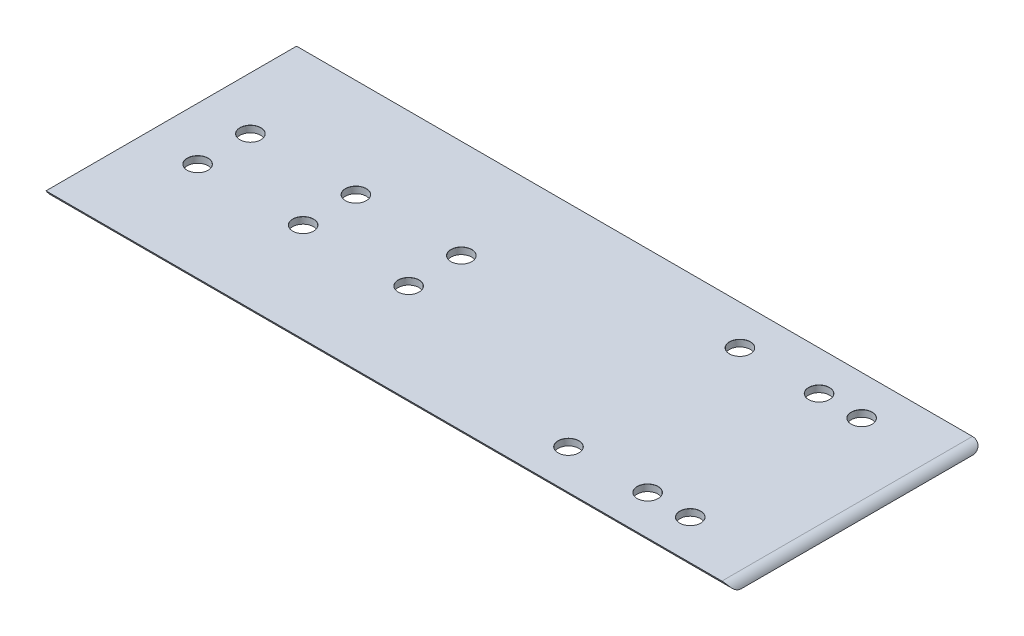
ISO-10303-21;
HEADER;
FILE_DESCRIPTION(('STEP AP214'),'2;1');
FILE_NAME('part.step','',(''),(''),'','','');
FILE_SCHEMA(('AUTOMOTIVE_DESIGN { 1 0 10303 214 1 1 1 1 }'));
ENDSEC;
DATA;
#1=APPLICATION_CONTEXT('core data for automotive mechanical design processes');
#2=APPLICATION_PROTOCOL_DEFINITION('international standard','automotive_design',2000,#1);
#3=PRODUCT_CONTEXT('',#1,'mechanical');
#4=PRODUCT('Part','Part','',(#3));
#5=PRODUCT_RELATED_PRODUCT_CATEGORY('part','',(#4));
#6=PRODUCT_DEFINITION_FORMATION('','',#4);
#7=PRODUCT_DEFINITION_CONTEXT('part definition',#1,'design');
#8=PRODUCT_DEFINITION('design','',#6,#7);
#9=PRODUCT_DEFINITION_SHAPE('','',#8);
#10=(LENGTH_UNIT() NAMED_UNIT(*) SI_UNIT(.MILLI.,.METRE.));
#11=(NAMED_UNIT(*) PLANE_ANGLE_UNIT() SI_UNIT($,.RADIAN.));
#12=(NAMED_UNIT(*) SI_UNIT($,.STERADIAN.) SOLID_ANGLE_UNIT());
#13=UNCERTAINTY_MEASURE_WITH_UNIT(LENGTH_MEASURE(1.E-05),#10,'distance_accuracy_value','');
#14=(GEOMETRIC_REPRESENTATION_CONTEXT(3) GLOBAL_UNCERTAINTY_ASSIGNED_CONTEXT((#13)) GLOBAL_UNIT_ASSIGNED_CONTEXT((#10,
#11,#12)) REPRESENTATION_CONTEXT('',''));
#15=CARTESIAN_POINT('',(0.,0.,0.));
#16=DIRECTION('',(0.,0.,1.));
#17=DIRECTION('',(1.,0.,0.));
#18=AXIS2_PLACEMENT_3D('',#15,#16,#17);
#19=CARTESIAN_POINT('',(0.,98.1075,-71.4375));
#20=DIRECTION('',(0.,1.,0.));
#21=DIRECTION('',(0.,0.,1.));
#22=AXIS2_PLACEMENT_3D('',#19,#20,#21);
#23=PLANE('',#22);
#24=CARTESIAN_POINT('',(167.083317581196,98.1075,-122.2375));
#25=DIRECTION('',(0.,1.,0.));
#26=DIRECTION('',(0.,0.,1.));
#27=AXIS2_PLACEMENT_3D('',#24,#25,#26);
#28=CIRCLE('',#27,2.5);
#29=CARTESIAN_POINT('',(167.083317581196,98.1075,-119.7375));
#30=VERTEX_POINT('',#29);
#31=EDGE_CURVE('E237',#30,#30,#28,.T.);
#32=ORIENTED_EDGE('',*,*,#31,.T.);
#33=EDGE_LOOP('',(#32));
#34=FACE_BOUND('',#33,.T.);
#35=CARTESIAN_POINT('',(167.083317581196,98.1075,-80.9625));
#36=DIRECTION('',(0.,1.,0.));
#37=DIRECTION('',(0.,0.,1.));
#38=AXIS2_PLACEMENT_3D('',#35,#36,#37);
#39=CIRCLE('',#38,2.5);
#40=CARTESIAN_POINT('',(167.083317581196,98.1075,-78.4625));
#41=VERTEX_POINT('',#40);
#42=EDGE_CURVE('E228',#41,#41,#39,.T.);
#43=ORIENTED_EDGE('',*,*,#42,.T.);
#44=EDGE_LOOP('',(#43));
#45=FACE_BOUND('',#44,.T.);
#46=CARTESIAN_POINT('',(186.133317581196,98.1075,-80.9625));
#47=DIRECTION('',(0.,1.,0.));
#48=DIRECTION('',(0.,0.,1.));
#49=AXIS2_PLACEMENT_3D('',#46,#47,#48);
#50=CIRCLE('',#49,2.5);
#51=CARTESIAN_POINT('',(186.133317581196,98.1075,-78.4625));
#52=VERTEX_POINT('',#51);
#53=EDGE_CURVE('E219',#52,#52,#50,.T.);
#54=ORIENTED_EDGE('',*,*,#53,.T.);
#55=EDGE_LOOP('',(#54));
#56=FACE_BOUND('',#55,.T.);
#57=CARTESIAN_POINT('',(196.394917581196,98.1075,-80.9625));
#58=DIRECTION('',(0.,1.,0.));
#59=DIRECTION('',(0.,0.,1.));
#60=AXIS2_PLACEMENT_3D('',#57,#58,#59);
#61=CIRCLE('',#60,2.5);
#62=CARTESIAN_POINT('',(196.394917581196,98.1075,-78.4625));
#63=VERTEX_POINT('',#62);
#64=EDGE_CURVE('E210',#63,#63,#61,.T.);
#65=ORIENTED_EDGE('',*,*,#64,.T.);
#66=EDGE_LOOP('',(#65));
#67=FACE_BOUND('',#66,.T.);
#68=CARTESIAN_POINT('',(196.394917581196,98.1075,-122.2375));
#69=DIRECTION('',(0.,1.,0.));
#70=DIRECTION('',(0.,0.,1.));
#71=AXIS2_PLACEMENT_3D('',#68,#69,#70);
#72=CIRCLE('',#71,2.5);
#73=CARTESIAN_POINT('',(196.394917581196,98.1075,-119.7375));
#74=VERTEX_POINT('',#73);
#75=EDGE_CURVE('E201',#74,#74,#72,.T.);
#76=ORIENTED_EDGE('',*,*,#75,.T.);
#77=EDGE_LOOP('',(#76));
#78=FACE_BOUND('',#77,.T.);
#79=CARTESIAN_POINT('',(186.133317581196,98.1075,-122.2375));
#80=DIRECTION('',(0.,1.,0.));
#81=DIRECTION('',(0.,0.,1.));
#82=AXIS2_PLACEMENT_3D('',#79,#80,#81);
#83=CIRCLE('',#82,2.5);
#84=CARTESIAN_POINT('',(186.133317581196,98.1075,-119.7375));
#85=VERTEX_POINT('',#84);
#86=EDGE_CURVE('E192',#85,#85,#83,.T.);
#87=ORIENTED_EDGE('',*,*,#86,.T.);
#88=EDGE_LOOP('',(#87));
#89=FACE_BOUND('',#88,.T.);
#90=CARTESIAN_POINT('',(114.3,98.1075,-107.95));
#91=DIRECTION('',(0.,1.,0.));
#92=DIRECTION('',(0.,0.,1.));
#93=AXIS2_PLACEMENT_3D('',#90,#91,#92);
#94=CIRCLE('',#93,2.5);
#95=CARTESIAN_POINT('',(114.3,98.1075,-105.45));
#96=VERTEX_POINT('',#95);
#97=EDGE_CURVE('E183',#96,#96,#94,.T.);
#98=ORIENTED_EDGE('',*,*,#97,.T.);
#99=EDGE_LOOP('',(#98));
#100=FACE_BOUND('',#99,.T.);
#101=CARTESIAN_POINT('',(114.3,98.1075,-95.25));
#102=DIRECTION('',(0.,1.,0.));
#103=DIRECTION('',(0.,0.,1.));
#104=AXIS2_PLACEMENT_3D('',#101,#102,#103);
#105=CIRCLE('',#104,2.5);
#106=CARTESIAN_POINT('',(114.3,98.1075,-92.75));
#107=VERTEX_POINT('',#106);
#108=EDGE_CURVE('E174',#107,#107,#105,.T.);
#109=ORIENTED_EDGE('',*,*,#108,.T.);
#110=EDGE_LOOP('',(#109));
#111=FACE_BOUND('',#110,.T.);
#112=CARTESIAN_POINT('',(88.9000000000002,98.1075,-95.25));
#113=DIRECTION('',(0.,1.,0.));
#114=DIRECTION('',(0.,0.,1.));
#115=AXIS2_PLACEMENT_3D('',#112,#113,#114);
#116=CIRCLE('',#115,2.5);
#117=CARTESIAN_POINT('',(88.9000000000002,98.1075,-92.75));
#118=VERTEX_POINT('',#117);
#119=EDGE_CURVE('E165',#118,#118,#116,.T.);
#120=ORIENTED_EDGE('',*,*,#119,.T.);
#121=EDGE_LOOP('',(#120));
#122=FACE_BOUND('',#121,.T.);
#123=CARTESIAN_POINT('',(88.9,98.1075,-107.95));
#124=DIRECTION('',(0.,1.,0.));
#125=DIRECTION('',(0.,0.,1.));
#126=AXIS2_PLACEMENT_3D('',#123,#124,#125);
#127=CIRCLE('',#126,2.5);
#128=CARTESIAN_POINT('',(88.9,98.1075,-105.45));
#129=VERTEX_POINT('',#128);
#130=EDGE_CURVE('E156',#129,#129,#127,.T.);
#131=ORIENTED_EDGE('',*,*,#130,.T.);
#132=EDGE_LOOP('',(#131));
#133=FACE_BOUND('',#132,.T.);
#134=CARTESIAN_POINT('',(63.5,98.1075,-107.95));
#135=DIRECTION('',(0.,1.,0.));
#136=DIRECTION('',(0.,0.,1.));
#137=AXIS2_PLACEMENT_3D('',#134,#135,#136);
#138=CIRCLE('',#137,2.5);
#139=CARTESIAN_POINT('',(63.5,98.1075,-105.45));
#140=VERTEX_POINT('',#139);
#141=EDGE_CURVE('E147',#140,#140,#138,.T.);
#142=ORIENTED_EDGE('',*,*,#141,.T.);
#143=EDGE_LOOP('',(#142));
#144=FACE_BOUND('',#143,.T.);
#145=CARTESIAN_POINT('',(63.5000000000002,98.1075,-95.25));
#146=DIRECTION('',(0.,1.,0.));
#147=DIRECTION('',(0.,0.,1.));
#148=AXIS2_PLACEMENT_3D('',#145,#146,#147);
#149=CIRCLE('',#148,2.5);
#150=CARTESIAN_POINT('',(63.5000000000002,98.1075,-92.75));
#151=VERTEX_POINT('',#150);
#152=EDGE_CURVE('E137',#151,#151,#149,.T.);
#153=ORIENTED_EDGE('',*,*,#152,.T.);
#154=EDGE_LOOP('',(#153));
#155=FACE_BOUND('',#154,.T.);
#156=DIRECTION('',(0.,0.,-1.));
#157=VECTOR('',#156,1.);
#158=CARTESIAN_POINT('',(53.1546430196529,98.1075,-71.4375));
#159=LINE('',#158,#157);
#160=CARTESIAN_POINT('',(53.1546430196529,98.1075,-73.7921430196529));
#161=VERTEX_POINT('',#160);
#162=CARTESIAN_POINT('',(53.1546430196529,98.1075,-129.407856980347));
#163=VERTEX_POINT('',#162);
#164=EDGE_CURVE('E63',#161,#163,#159,.T.);
#165=ORIENTED_EDGE('',*,*,#164,.T.);
#166=DIRECTION('',(-1.,0.,0.));
#167=VECTOR('',#166,1.);
#168=CARTESIAN_POINT('',(0.,98.1075,-129.407856980347));
#169=LINE('',#168,#167);
#170=CARTESIAN_POINT('',(215.9,98.1075,-129.407856980347));
#171=VERTEX_POINT('',#170);
#172=EDGE_CURVE('E105',#163,#171,#169,.F.);
#173=ORIENTED_EDGE('',*,*,#172,.T.);
#174=DIRECTION('',(0.,0.,-1.));
#175=VECTOR('',#174,1.);
#176=CARTESIAN_POINT('',(215.9,98.1075,-71.4375));
#177=LINE('',#176,#175);
#178=CARTESIAN_POINT('',(215.9,98.1075,-73.7921430196529));
#179=VERTEX_POINT('',#178);
#180=EDGE_CURVE('E99',#179,#171,#177,.T.);
#181=ORIENTED_EDGE('',*,*,#180,.F.);
#182=DIRECTION('',(-1.,0.,0.));
#183=VECTOR('',#182,1.);
#184=CARTESIAN_POINT('',(0.,98.1075,-73.7921430196529));
#185=LINE('',#184,#183);
#186=EDGE_CURVE('E106',#179,#161,#185,.T.);
#187=ORIENTED_EDGE('',*,*,#186,.T.);
#188=EDGE_LOOP('',(#165,#173,#181,#187));
#189=FACE_BOUND('',#188,.T.);
#190=ADVANCED_FACE('F47',(#34,#45,#56,#67,#78,#89,#100,#111,#122,#133,#144,#155,#189),#23,.F.);
#191=CARTESIAN_POINT('',(0.,99.695,-71.4375));
#192=DIRECTION('',(0.,1.,0.));
#193=DIRECTION('',(0.,0.,1.));
#194=AXIS2_PLACEMENT_3D('',#191,#192,#193);
#195=PLANE('',#194);
#196=CARTESIAN_POINT('',(167.083317581196,99.695,-122.2375));
#197=DIRECTION('',(0.,1.,0.));
#198=DIRECTION('',(0.,0.,1.));
#199=AXIS2_PLACEMENT_3D('',#196,#197,#198);
#200=CIRCLE('',#199,2.525);
#201=CARTESIAN_POINT('',(167.083317581196,99.695,-119.7125));
#202=VERTEX_POINT('',#201);
#203=EDGE_CURVE('E243',#202,#202,#200,.T.);
#204=ORIENTED_EDGE('',*,*,#203,.F.);
#205=EDGE_LOOP('',(#204));
#206=FACE_BOUND('',#205,.T.);
#207=CARTESIAN_POINT('',(167.083317581196,99.695,-80.9625));
#208=DIRECTION('',(0.,1.,0.));
#209=DIRECTION('',(0.,0.,1.));
#210=AXIS2_PLACEMENT_3D('',#207,#208,#209);
#211=CIRCLE('',#210,2.525);
#212=CARTESIAN_POINT('',(167.083317581196,99.695,-78.4375));
#213=VERTEX_POINT('',#212);
#214=EDGE_CURVE('E234',#213,#213,#211,.T.);
#215=ORIENTED_EDGE('',*,*,#214,.F.);
#216=EDGE_LOOP('',(#215));
#217=FACE_BOUND('',#216,.T.);
#218=CARTESIAN_POINT('',(186.133317581196,99.695,-80.9625));
#219=DIRECTION('',(0.,1.,0.));
#220=DIRECTION('',(0.,0.,1.));
#221=AXIS2_PLACEMENT_3D('',#218,#219,#220);
#222=CIRCLE('',#221,2.525);
#223=CARTESIAN_POINT('',(186.133317581196,99.695,-78.4375));
#224=VERTEX_POINT('',#223);
#225=EDGE_CURVE('E225',#224,#224,#222,.T.);
#226=ORIENTED_EDGE('',*,*,#225,.F.);
#227=EDGE_LOOP('',(#226));
#228=FACE_BOUND('',#227,.T.);
#229=CARTESIAN_POINT('',(196.394917581196,99.695,-80.9625));
#230=DIRECTION('',(0.,1.,0.));
#231=DIRECTION('',(0.,0.,1.));
#232=AXIS2_PLACEMENT_3D('',#229,#230,#231);
#233=CIRCLE('',#232,2.525);
#234=CARTESIAN_POINT('',(196.394917581196,99.695,-78.4375));
#235=VERTEX_POINT('',#234);
#236=EDGE_CURVE('E216',#235,#235,#233,.T.);
#237=ORIENTED_EDGE('',*,*,#236,.F.);
#238=EDGE_LOOP('',(#237));
#239=FACE_BOUND('',#238,.T.);
#240=CARTESIAN_POINT('',(196.394917581196,99.695,-122.2375));
#241=DIRECTION('',(0.,1.,0.));
#242=DIRECTION('',(0.,0.,1.));
#243=AXIS2_PLACEMENT_3D('',#240,#241,#242);
#244=CIRCLE('',#243,2.525);
#245=CARTESIAN_POINT('',(196.394917581196,99.695,-119.7125));
#246=VERTEX_POINT('',#245);
#247=EDGE_CURVE('E207',#246,#246,#244,.T.);
#248=ORIENTED_EDGE('',*,*,#247,.F.);
#249=EDGE_LOOP('',(#248));
#250=FACE_BOUND('',#249,.T.);
#251=CARTESIAN_POINT('',(186.133317581196,99.695,-122.2375));
#252=DIRECTION('',(0.,1.,0.));
#253=DIRECTION('',(0.,0.,1.));
#254=AXIS2_PLACEMENT_3D('',#251,#252,#253);
#255=CIRCLE('',#254,2.525);
#256=CARTESIAN_POINT('',(186.133317581196,99.695,-119.7125));
#257=VERTEX_POINT('',#256);
#258=EDGE_CURVE('E198',#257,#257,#255,.T.);
#259=ORIENTED_EDGE('',*,*,#258,.F.);
#260=EDGE_LOOP('',(#259));
#261=FACE_BOUND('',#260,.T.);
#262=CARTESIAN_POINT('',(114.3,99.695,-107.95));
#263=DIRECTION('',(0.,1.,0.));
#264=DIRECTION('',(0.,0.,1.));
#265=AXIS2_PLACEMENT_3D('',#262,#263,#264);
#266=CIRCLE('',#265,2.525);
#267=CARTESIAN_POINT('',(114.3,99.695,-105.425));
#268=VERTEX_POINT('',#267);
#269=EDGE_CURVE('E189',#268,#268,#266,.T.);
#270=ORIENTED_EDGE('',*,*,#269,.F.);
#271=EDGE_LOOP('',(#270));
#272=FACE_BOUND('',#271,.T.);
#273=CARTESIAN_POINT('',(114.3,99.695,-95.25));
#274=DIRECTION('',(0.,1.,0.));
#275=DIRECTION('',(0.,0.,1.));
#276=AXIS2_PLACEMENT_3D('',#273,#274,#275);
#277=CIRCLE('',#276,2.525);
#278=CARTESIAN_POINT('',(114.3,99.695,-92.725));
#279=VERTEX_POINT('',#278);
#280=EDGE_CURVE('E180',#279,#279,#277,.T.);
#281=ORIENTED_EDGE('',*,*,#280,.F.);
#282=EDGE_LOOP('',(#281));
#283=FACE_BOUND('',#282,.T.);
#284=CARTESIAN_POINT('',(88.9000000000002,99.695,-95.25));
#285=DIRECTION('',(0.,1.,0.));
#286=DIRECTION('',(0.,0.,1.));
#287=AXIS2_PLACEMENT_3D('',#284,#285,#286);
#288=CIRCLE('',#287,2.525);
#289=CARTESIAN_POINT('',(88.9000000000002,99.695,-92.725));
#290=VERTEX_POINT('',#289);
#291=EDGE_CURVE('E171',#290,#290,#288,.T.);
#292=ORIENTED_EDGE('',*,*,#291,.F.);
#293=EDGE_LOOP('',(#292));
#294=FACE_BOUND('',#293,.T.);
#295=CARTESIAN_POINT('',(88.9,99.695,-107.95));
#296=DIRECTION('',(0.,1.,0.));
#297=DIRECTION('',(0.,0.,1.));
#298=AXIS2_PLACEMENT_3D('',#295,#296,#297);
#299=CIRCLE('',#298,2.525);
#300=CARTESIAN_POINT('',(88.9,99.695,-105.425));
#301=VERTEX_POINT('',#300);
#302=EDGE_CURVE('E162',#301,#301,#299,.T.);
#303=ORIENTED_EDGE('',*,*,#302,.F.);
#304=EDGE_LOOP('',(#303));
#305=FACE_BOUND('',#304,.T.);
#306=CARTESIAN_POINT('',(63.5,99.695,-107.95));
#307=DIRECTION('',(0.,1.,0.));
#308=DIRECTION('',(0.,0.,1.));
#309=AXIS2_PLACEMENT_3D('',#306,#307,#308);
#310=CIRCLE('',#309,2.525);
#311=CARTESIAN_POINT('',(63.5,99.695,-105.425));
#312=VERTEX_POINT('',#311);
#313=EDGE_CURVE('E153',#312,#312,#310,.T.);
#314=ORIENTED_EDGE('',*,*,#313,.F.);
#315=EDGE_LOOP('',(#314));
#316=FACE_BOUND('',#315,.T.);
#317=CARTESIAN_POINT('',(63.5000000000002,99.695,-95.25));
#318=DIRECTION('',(0.,1.,0.));
#319=DIRECTION('',(0.,0.,1.));
#320=AXIS2_PLACEMENT_3D('',#317,#318,#319);
#321=CIRCLE('',#320,2.525);
#322=CARTESIAN_POINT('',(63.5000000000002,99.695,-92.725));
#323=VERTEX_POINT('',#322);
#324=EDGE_CURVE('E144',#323,#323,#321,.T.);
#325=ORIENTED_EDGE('',*,*,#324,.F.);
#326=EDGE_LOOP('',(#325));
#327=FACE_BOUND('',#326,.T.);
#328=DIRECTION('',(1.,0.,0.));
#329=VECTOR('',#328,1.);
#330=CARTESIAN_POINT('',(0.,99.695,-71.4375));
#331=LINE('',#330,#329);
#332=CARTESIAN_POINT('',(50.8,99.695,-71.4375));
#333=VERTEX_POINT('',#332);
#334=CARTESIAN_POINT('',(213.545356980347,99.695,-71.4375));
#335=VERTEX_POINT('',#334);
#336=EDGE_CURVE('E93',#333,#335,#331,.T.);
#337=ORIENTED_EDGE('',*,*,#336,.T.);
#338=DIRECTION('',(0.,0.,1.));
#339=VECTOR('',#338,1.);
#340=CARTESIAN_POINT('',(213.545356980347,99.695,-131.7625));
#341=LINE('',#340,#339);
#342=CARTESIAN_POINT('',(213.545356980347,99.695,-131.7625));
#343=VERTEX_POINT('',#342);
#344=EDGE_CURVE('E133',#335,#343,#341,.F.);
#345=ORIENTED_EDGE('',*,*,#344,.T.);
#346=DIRECTION('',(1.,0.,0.));
#347=VECTOR('',#346,1.);
#348=CARTESIAN_POINT('',(0.,99.695,-131.7625));
#349=LINE('',#348,#347);
#350=CARTESIAN_POINT('',(50.8,99.695,-131.7625));
#351=VERTEX_POINT('',#350);
#352=EDGE_CURVE('E96',#351,#343,#349,.T.);
#353=ORIENTED_EDGE('',*,*,#352,.F.);
#354=DIRECTION('',(0.,0.,-1.));
#355=VECTOR('',#354,1.);
#356=CARTESIAN_POINT('',(50.8,99.695,-71.4375));
#357=LINE('',#356,#355);
#358=EDGE_CURVE('E90',#333,#351,#357,.T.);
#359=ORIENTED_EDGE('',*,*,#358,.F.);
#360=EDGE_LOOP('',(#337,#345,#353,#359));
#361=FACE_BOUND('',#360,.T.);
#362=ADVANCED_FACE('F91',(#206,#217,#228,#239,#250,#261,#272,#283,#294,#305,#316,#327,#361),
#195,.T.);
#363=CARTESIAN_POINT('',(63.5000000000002,99.695,-95.25));
#364=DIRECTION('',(0.,1.,0.));
#365=DIRECTION('',(0.,0.,1.));
#366=AXIS2_PLACEMENT_3D('',#363,#364,#365);
#367=CYLINDRICAL_SURFACE('',#366,2.5);
#368=ORIENTED_EDGE('',*,*,#152,.F.);
#369=EDGE_LOOP('',(#368));
#370=FACE_BOUND('',#369,.T.);
#371=CARTESIAN_POINT('',(63.5000000000002,99.67,-95.25));
#372=DIRECTION('',(0.,1.,0.));
#373=DIRECTION('',(0.,0.,1.));
#374=AXIS2_PLACEMENT_3D('',#371,#372,#373);
#375=CIRCLE('',#374,2.5);
#376=CARTESIAN_POINT('',(63.5000000000002,99.67,-92.75));
#377=VERTEX_POINT('',#376);
#378=EDGE_CURVE('E141',#377,#377,#375,.T.);
#379=ORIENTED_EDGE('',*,*,#378,.T.);
#380=EDGE_LOOP('',(#379));
#381=FACE_BOUND('',#380,.T.);
#382=ADVANCED_FACE('F251',(#370,#381),#367,.F.);
#383=CARTESIAN_POINT('',(63.5000000000002,99.695,-95.25));
#384=DIRECTION('',(0.,1.,0.));
#385=DIRECTION('',(0.,0.,1.));
#386=AXIS2_PLACEMENT_3D('',#383,#384,#385);
#387=CONICAL_SURFACE('',#386,2.525,0.785398163397448);
#388=ORIENTED_EDGE('',*,*,#378,.F.);
#389=EDGE_LOOP('',(#388));
#390=FACE_BOUND('',#389,.T.);
#391=ORIENTED_EDGE('',*,*,#324,.T.);
#392=EDGE_LOOP('',(#391));
#393=FACE_BOUND('',#392,.T.);
#394=ADVANCED_FACE('F275',(#390,#393),#387,.F.);
#395=CARTESIAN_POINT('',(63.5,99.695,-107.95));
#396=DIRECTION('',(0.,1.,0.));
#397=DIRECTION('',(0.,0.,1.));
#398=AXIS2_PLACEMENT_3D('',#395,#396,#397);
#399=CYLINDRICAL_SURFACE('',#398,2.5);
#400=ORIENTED_EDGE('',*,*,#141,.F.);
#401=EDGE_LOOP('',(#400));
#402=FACE_BOUND('',#401,.T.);
#403=CARTESIAN_POINT('',(63.5,99.67,-107.95));
#404=DIRECTION('',(0.,1.,0.));
#405=DIRECTION('',(0.,0.,1.));
#406=AXIS2_PLACEMENT_3D('',#403,#404,#405);
#407=CIRCLE('',#406,2.5);
#408=CARTESIAN_POINT('',(63.5,99.67,-105.45));
#409=VERTEX_POINT('',#408);
#410=EDGE_CURVE('E150',#409,#409,#407,.T.);
#411=ORIENTED_EDGE('',*,*,#410,.T.);
#412=EDGE_LOOP('',(#411));
#413=FACE_BOUND('',#412,.T.);
#414=ADVANCED_FACE('F277',(#402,#413),#399,.F.);
#415=CARTESIAN_POINT('',(63.5,99.695,-107.95));
#416=DIRECTION('',(0.,1.,0.));
#417=DIRECTION('',(0.,0.,1.));
#418=AXIS2_PLACEMENT_3D('',#415,#416,#417);
#419=CONICAL_SURFACE('',#418,2.525,0.785398163397448);
#420=ORIENTED_EDGE('',*,*,#410,.F.);
#421=EDGE_LOOP('',(#420));
#422=FACE_BOUND('',#421,.T.);
#423=ORIENTED_EDGE('',*,*,#313,.T.);
#424=EDGE_LOOP('',(#423));
#425=FACE_BOUND('',#424,.T.);
#426=ADVANCED_FACE('F284',(#422,#425),#419,.F.);
#427=CARTESIAN_POINT('',(88.9,99.695,-107.95));
#428=DIRECTION('',(0.,1.,0.));
#429=DIRECTION('',(0.,0.,1.));
#430=AXIS2_PLACEMENT_3D('',#427,#428,#429);
#431=CYLINDRICAL_SURFACE('',#430,2.5);
#432=ORIENTED_EDGE('',*,*,#130,.F.);
#433=EDGE_LOOP('',(#432));
#434=FACE_BOUND('',#433,.T.);
#435=CARTESIAN_POINT('',(88.9,99.67,-107.95));
#436=DIRECTION('',(0.,1.,0.));
#437=DIRECTION('',(0.,0.,1.));
#438=AXIS2_PLACEMENT_3D('',#435,#436,#437);
#439=CIRCLE('',#438,2.5);
#440=CARTESIAN_POINT('',(88.9,99.67,-105.45));
#441=VERTEX_POINT('',#440);
#442=EDGE_CURVE('E159',#441,#441,#439,.T.);
#443=ORIENTED_EDGE('',*,*,#442,.T.);
#444=EDGE_LOOP('',(#443));
#445=FACE_BOUND('',#444,.T.);
#446=ADVANCED_FACE('F322',(#434,#445),#431,.F.);
#447=CARTESIAN_POINT('',(88.9,99.695,-107.95));
#448=DIRECTION('',(0.,1.,0.));
#449=DIRECTION('',(0.,0.,1.));
#450=AXIS2_PLACEMENT_3D('',#447,#448,#449);
#451=CONICAL_SURFACE('',#450,2.525,0.785398163397448);
#452=ORIENTED_EDGE('',*,*,#442,.F.);
#453=EDGE_LOOP('',(#452));
#454=FACE_BOUND('',#453,.T.);
#455=ORIENTED_EDGE('',*,*,#302,.T.);
#456=EDGE_LOOP('',(#455));
#457=FACE_BOUND('',#456,.T.);
#458=ADVANCED_FACE('F327',(#454,#457),#451,.F.);
#459=CARTESIAN_POINT('',(88.9000000000002,99.695,-95.25));
#460=DIRECTION('',(0.,1.,0.));
#461=DIRECTION('',(0.,0.,1.));
#462=AXIS2_PLACEMENT_3D('',#459,#460,#461);
#463=CYLINDRICAL_SURFACE('',#462,2.5);
#464=ORIENTED_EDGE('',*,*,#119,.F.);
#465=EDGE_LOOP('',(#464));
#466=FACE_BOUND('',#465,.T.);
#467=CARTESIAN_POINT('',(88.9000000000002,99.67,-95.25));
#468=DIRECTION('',(0.,1.,0.));
#469=DIRECTION('',(0.,0.,1.));
#470=AXIS2_PLACEMENT_3D('',#467,#468,#469);
#471=CIRCLE('',#470,2.5);
#472=CARTESIAN_POINT('',(88.9000000000002,99.67,-92.75));
#473=VERTEX_POINT('',#472);
#474=EDGE_CURVE('E168',#473,#473,#471,.T.);
#475=ORIENTED_EDGE('',*,*,#474,.T.);
#476=EDGE_LOOP('',(#475));
#477=FACE_BOUND('',#476,.T.);
#478=ADVANCED_FACE('F333',(#466,#477),#463,.F.);
#479=CARTESIAN_POINT('',(88.9000000000002,99.695,-95.25));
#480=DIRECTION('',(0.,1.,0.));
#481=DIRECTION('',(0.,0.,1.));
#482=AXIS2_PLACEMENT_3D('',#479,#480,#481);
#483=CONICAL_SURFACE('',#482,2.525,0.785398163397448);
#484=ORIENTED_EDGE('',*,*,#474,.F.);
#485=EDGE_LOOP('',(#484));
#486=FACE_BOUND('',#485,.T.);
#487=ORIENTED_EDGE('',*,*,#291,.T.);
#488=EDGE_LOOP('',(#487));
#489=FACE_BOUND('',#488,.T.);
#490=ADVANCED_FACE('F337',(#486,#489),#483,.F.);
#491=CARTESIAN_POINT('',(114.3,99.695,-95.25));
#492=DIRECTION('',(0.,1.,0.));
#493=DIRECTION('',(0.,0.,1.));
#494=AXIS2_PLACEMENT_3D('',#491,#492,#493);
#495=CYLINDRICAL_SURFACE('',#494,2.5);
#496=ORIENTED_EDGE('',*,*,#108,.F.);
#497=EDGE_LOOP('',(#496));
#498=FACE_BOUND('',#497,.T.);
#499=CARTESIAN_POINT('',(114.3,99.67,-95.25));
#500=DIRECTION('',(0.,1.,0.));
#501=DIRECTION('',(0.,0.,1.));
#502=AXIS2_PLACEMENT_3D('',#499,#500,#501);
#503=CIRCLE('',#502,2.5);
#504=CARTESIAN_POINT('',(114.3,99.67,-92.75));
#505=VERTEX_POINT('',#504);
#506=EDGE_CURVE('E177',#505,#505,#503,.T.);
#507=ORIENTED_EDGE('',*,*,#506,.T.);
#508=EDGE_LOOP('',(#507));
#509=FACE_BOUND('',#508,.T.);
#510=ADVANCED_FACE('F341',(#498,#509),#495,.F.);
#511=CARTESIAN_POINT('',(114.3,99.695,-95.25));
#512=DIRECTION('',(0.,1.,0.));
#513=DIRECTION('',(0.,0.,1.));
#514=AXIS2_PLACEMENT_3D('',#511,#512,#513);
#515=CONICAL_SURFACE('',#514,2.525,0.785398163397448);
#516=ORIENTED_EDGE('',*,*,#506,.F.);
#517=EDGE_LOOP('',(#516));
#518=FACE_BOUND('',#517,.T.);
#519=ORIENTED_EDGE('',*,*,#280,.T.);
#520=EDGE_LOOP('',(#519));
#521=FACE_BOUND('',#520,.T.);
#522=ADVANCED_FACE('F345',(#518,#521),#515,.F.);
#523=CARTESIAN_POINT('',(114.3,99.695,-107.95));
#524=DIRECTION('',(0.,1.,0.));
#525=DIRECTION('',(0.,0.,1.));
#526=AXIS2_PLACEMENT_3D('',#523,#524,#525);
#527=CYLINDRICAL_SURFACE('',#526,2.5);
#528=ORIENTED_EDGE('',*,*,#97,.F.);
#529=EDGE_LOOP('',(#528));
#530=FACE_BOUND('',#529,.T.);
#531=CARTESIAN_POINT('',(114.3,99.67,-107.95));
#532=DIRECTION('',(0.,1.,0.));
#533=DIRECTION('',(0.,0.,1.));
#534=AXIS2_PLACEMENT_3D('',#531,#532,#533);
#535=CIRCLE('',#534,2.5);
#536=CARTESIAN_POINT('',(114.3,99.67,-105.45));
#537=VERTEX_POINT('',#536);
#538=EDGE_CURVE('E186',#537,#537,#535,.T.);
#539=ORIENTED_EDGE('',*,*,#538,.T.);
#540=EDGE_LOOP('',(#539));
#541=FACE_BOUND('',#540,.T.);
#542=ADVANCED_FACE('F349',(#530,#541),#527,.F.);
#543=CARTESIAN_POINT('',(114.3,99.695,-107.95));
#544=DIRECTION('',(0.,1.,0.));
#545=DIRECTION('',(0.,0.,1.));
#546=AXIS2_PLACEMENT_3D('',#543,#544,#545);
#547=CONICAL_SURFACE('',#546,2.525,0.785398163397448);
#548=ORIENTED_EDGE('',*,*,#538,.F.);
#549=EDGE_LOOP('',(#548));
#550=FACE_BOUND('',#549,.T.);
#551=ORIENTED_EDGE('',*,*,#269,.T.);
#552=EDGE_LOOP('',(#551));
#553=FACE_BOUND('',#552,.T.);
#554=ADVANCED_FACE('F353',(#550,#553),#547,.F.);
#555=CARTESIAN_POINT('',(213.545356980347,97.155,-71.4375));
#556=DIRECTION('',(0.,0.,-1.));
#557=DIRECTION('',(-1.,0.,0.));
#558=AXIS2_PLACEMENT_3D('',#555,#556,#557);
#559=CYLINDRICAL_SURFACE('',#558,2.54);
#560=ORIENTED_EDGE('',*,*,#180,.T.);
#561=CARTESIAN_POINT('',(215.9,98.1075,-129.407856980347));
#562=CARTESIAN_POINT('',(215.899984993475,98.1074924304385,-129.471643914709));
#563=CARTESIAN_POINT('',(215.899027515285,98.1099028225804,-129.535430176732));
#564=CARTESIAN_POINT('',(215.895119250132,98.1195032994572,-129.662590807907));
#565=CARTESIAN_POINT('',(215.892168134815,98.1266941715389,-129.725965107471));
#566=CARTESIAN_POINT('',(215.884152361534,98.1458275137216,-129.852055622194));
#567=CARTESIAN_POINT('',(215.879081496262,98.1577839340554,-129.914769345453));
#568=CARTESIAN_POINT('',(215.866616095607,98.186307360381,-130.038882657651));
#569=CARTESIAN_POINT('',(215.859221682038,98.2028741246665,-130.1002823153));
#570=CARTESIAN_POINT('',(215.833112344637,98.259325274202,-130.282091018387));
#571=CARTESIAN_POINT('',(215.810478953702,98.3059389440406,-130.399969826774));
#572=CARTESIAN_POINT('',(215.751971105743,98.4144503166867,-130.624666188358));
#573=CARTESIAN_POINT('',(215.716120282493,98.4763206743837,-130.731503051482));
#574=CARTESIAN_POINT('',(215.63030809796,98.6077221089483,-130.925737802798));
#575=CARTESIAN_POINT('',(215.581129501243,98.6767251526924,-131.013834356421));
#576=CARTESIAN_POINT('',(215.466382457924,98.8192047974412,-131.174336684035));
#577=CARTESIAN_POINT('',(215.400822147925,98.8926791639288,-131.246750214366));
#578=CARTESIAN_POINT('',(215.260382285394,99.0309188234451,-131.368979828158));
#579=CARTESIAN_POINT('',(215.186949151796,99.0958556342993,-131.420276522847));
#580=CARTESIAN_POINT('',(215.028141412988,99.2197243280292,-131.509979483143));
#581=CARTESIAN_POINT('',(214.942765416054,99.2786555096724,-131.548384244653));
#582=CARTESIAN_POINT('',(214.761295504796,99.3875836147899,-131.614284637002));
#583=CARTESIAN_POINT('',(214.66509493175,99.4374761798381,-131.641656826026));
#584=CARTESIAN_POINT('',(214.465124675619,99.5251377866003,-131.686969211947));
#585=CARTESIAN_POINT('',(214.361347769054,99.5628950679665,-131.704900270083));
#586=CARTESIAN_POINT('',(214.197872132206,99.610483889879,-131.726589774989));
#587=CARTESIAN_POINT('',(214.139879729793,99.6251687650598,-131.733072364123));
#588=CARTESIAN_POINT('',(214.022803263219,99.6504412068136,-131.744021640604));
#589=CARTESIAN_POINT('',(213.96371908458,99.6610283411314,-131.748488115288));
#590=CARTESIAN_POINT('',(213.844925081888,99.6779851035315,-131.755564206114));
#591=CARTESIAN_POINT('',(213.78521621237,99.6843604178674,-131.758176326123));
#592=CARTESIAN_POINT('',(213.66545731021,99.692870493689,-131.761638157709));
#593=CARTESIAN_POINT('',(213.605407343912,99.6950060532778,-131.762488200985));
#594=CARTESIAN_POINT('',(213.545356980347,99.695,-131.7625));
#595=B_SPLINE_CURVE_WITH_KNOTS('',3,(#561,#562,#563,#564,#565,#566,#567,#568,#569,#570,#571,
#572,#573,#574,#575,#576,#577,#578,#579,#580,#581,#582,#583,#584,#585,#586,#587,#588,#589,#590,
#591,#592,#593,#594),.UNSPECIFIED.,.F.,.F.,(4,2,2,2,2,2,2,2,2,2,2,2,2,2,2,2,4),(0.,
0.191306313729718,0.382644143482354,0.574546240942362,0.766438279457222,1.15064251848747,
1.53416307686345,1.89877650696502,2.26320919661649,2.59353492632602,2.92389918161738,
3.25786354728498,3.59215058994251,3.77251551403737,3.95289945896401,4.13303937246852,
4.3131453727216),.UNSPECIFIED.);
#596=EDGE_CURVE('E56',#171,#343,#595,.T.);
#597=ORIENTED_EDGE('',*,*,#596,.T.);
#598=ORIENTED_EDGE('',*,*,#344,.F.);
#599=CARTESIAN_POINT('',(213.545356980347,99.695,-71.4375));
#600=CARTESIAN_POINT('',(213.609143914709,99.6950075695615,-71.4375150065247));
#601=CARTESIAN_POINT('',(213.672930176732,99.6925971774196,-71.4384724847149));
#602=CARTESIAN_POINT('',(213.800090807907,99.6829967005427,-71.4423807498681));
#603=CARTESIAN_POINT('',(213.863465107471,99.6758058284611,-71.4453318651851));
#604=CARTESIAN_POINT('',(213.989555622193,99.6566724862784,-71.4533476384655));
#605=CARTESIAN_POINT('',(214.052269345453,99.6447160659446,-71.4584185037378));
#606=CARTESIAN_POINT('',(214.176382657651,99.616192639619,-71.4708839043932));
#607=CARTESIAN_POINT('',(214.2377823153,99.5996258753335,-71.4782783179624));
#608=CARTESIAN_POINT('',(214.419591018387,99.543174725798,-71.5043876553632));
#609=CARTESIAN_POINT('',(214.537469826774,99.4965610559594,-71.5270210462979));
#610=CARTESIAN_POINT('',(214.762166188358,99.3880496833132,-71.5855288942567));
#611=CARTESIAN_POINT('',(214.869003051482,99.3261793256163,-71.6213797175066));
#612=CARTESIAN_POINT('',(215.063237802798,99.1947778910517,-71.7071919020402));
#613=CARTESIAN_POINT('',(215.151334356421,99.1257748473076,-71.7563704987571));
#614=CARTESIAN_POINT('',(215.311836684035,98.9832952025587,-71.8711175420761));
#615=CARTESIAN_POINT('',(215.384250214366,98.9098208360712,-71.9366778520746));
#616=CARTESIAN_POINT('',(215.506479828158,98.7715811765549,-72.0771177146058));
#617=CARTESIAN_POINT('',(215.557776522847,98.7066443657007,-72.1505508482044));
#618=CARTESIAN_POINT('',(215.647479483143,98.5827756719708,-72.3093585870124));
#619=CARTESIAN_POINT('',(215.685884244653,98.5238444903275,-72.3947345839455));
#620=CARTESIAN_POINT('',(215.751784637002,98.41491638521,-72.5762044952039));
#621=CARTESIAN_POINT('',(215.779156826026,98.3650238201619,-72.6724050682501));
#622=CARTESIAN_POINT('',(215.824469211947,98.2773622133997,-72.8723753243811));
#623=CARTESIAN_POINT('',(215.842400270083,98.2396049320335,-72.9761522309464));
#624=CARTESIAN_POINT('',(215.864089774989,98.1920161101209,-73.1396278677937));
#625=CARTESIAN_POINT('',(215.870572364123,98.1773312349402,-73.1976202702074));
#626=CARTESIAN_POINT('',(215.881521640604,98.1520587931864,-73.3146967367809));
#627=CARTESIAN_POINT('',(215.885988115288,98.1414716588686,-73.3737809154197));
#628=CARTESIAN_POINT('',(215.893064206114,98.1245148964685,-73.4925749181122));
#629=CARTESIAN_POINT('',(215.895676326123,98.1181395821326,-73.5522837876298));
#630=CARTESIAN_POINT('',(215.899138157709,98.109629506311,-73.6720426897897));
#631=CARTESIAN_POINT('',(215.899988200985,98.1074939467222,-73.7320926560882));
#632=CARTESIAN_POINT('',(215.9,98.1075,-73.7921430196529));
#633=B_SPLINE_CURVE_WITH_KNOTS('',3,(#599,#600,#601,#602,#603,#604,#605,#606,#607,#608,#609,
#610,#611,#612,#613,#614,#615,#616,#617,#618,#619,#620,#621,#622,#623,#624,#625,#626,#627,#628,
#629,#630,#631,#632),.UNSPECIFIED.,.F.,.F.,(4,2,2,2,2,2,2,2,2,2,2,2,2,2,2,2,4),(0.,
0.191306313729718,0.382644143482327,0.574546240942304,0.766438279457223,1.15064251848747,
1.53416307686345,1.89877650696505,2.2632091966165,2.59353492632601,2.92389918161738,
3.25786354728495,3.59215058994251,3.77251551403741,3.95289945896404,4.13303937246851,
4.31314537272159),.UNSPECIFIED.);
#634=EDGE_CURVE('E102',#335,#179,#633,.T.);
#635=ORIENTED_EDGE('',*,*,#634,.T.);
#636=EDGE_LOOP('',(#560,#597,#598,#635));
#637=FACE_BOUND('',#636,.T.);
#638=ADVANCED_FACE('F117',(#637),#559,.T.);
#639=CARTESIAN_POINT('',(0.,100.6475,-73.7921430196529));
#640=DIRECTION('',(-1.,0.,0.));
#641=DIRECTION('',(0.,0.,1.));
#642=AXIS2_PLACEMENT_3D('',#639,#640,#641);
#643=CYLINDRICAL_SURFACE('',#642,2.54);
#644=ORIENTED_EDGE('',*,*,#336,.F.);
#645=CARTESIAN_POINT('',(53.1546430196529,100.6475,-73.7921430196529));
#646=DIRECTION('',(-0.707106781186547,0.,-0.707106781186547));
#647=DIRECTION('',(-0.707106781186547,0.,0.707106781186547));
#648=AXIS2_PLACEMENT_3D('',#645,#646,#647);
#649=ELLIPSE('',#648,3.59210244842766,2.54);
#650=EDGE_CURVE('E11',#333,#161,#649,.F.);
#651=ORIENTED_EDGE('',*,*,#650,.T.);
#652=ORIENTED_EDGE('',*,*,#186,.F.);
#653=ORIENTED_EDGE('',*,*,#634,.F.);
#654=EDGE_LOOP('',(#644,#651,#652,#653));
#655=FACE_BOUND('',#654,.T.);
#656=ADVANCED_FACE('F101',(#655),#643,.T.);
#657=CARTESIAN_POINT('',(53.1546430196529,100.6475,-71.4375));
#658=DIRECTION('',(0.,0.,-1.));
#659=DIRECTION('',(-1.,0.,0.));
#660=AXIS2_PLACEMENT_3D('',#657,#658,#659);
#661=CYLINDRICAL_SURFACE('',#660,2.54);
#662=ORIENTED_EDGE('',*,*,#650,.F.);
#663=ORIENTED_EDGE('',*,*,#358,.T.);
#664=CARTESIAN_POINT('',(53.1546430196529,100.6475,-129.407856980347));
#665=DIRECTION('',(0.707106781186547,0.,-0.707106781186547));
#666=DIRECTION('',(-0.707106781186547,0.,-0.707106781186547));
#667=AXIS2_PLACEMENT_3D('',#664,#665,#666);
#668=ELLIPSE('',#667,3.59210244842766,2.54);
#669=EDGE_CURVE('E51',#163,#351,#668,.T.);
#670=ORIENTED_EDGE('',*,*,#669,.F.);
#671=ORIENTED_EDGE('',*,*,#164,.F.);
#672=EDGE_LOOP('',(#662,#663,#670,#671));
#673=FACE_BOUND('',#672,.T.);
#674=ADVANCED_FACE('F49',(#673),#661,.T.);
#675=CARTESIAN_POINT('',(0.,100.6475,-129.407856980347));
#676=DIRECTION('',(-1.,0.,0.));
#677=DIRECTION('',(0.,0.,1.));
#678=AXIS2_PLACEMENT_3D('',#675,#676,#677);
#679=CYLINDRICAL_SURFACE('',#678,2.54);
#680=ORIENTED_EDGE('',*,*,#669,.T.);
#681=ORIENTED_EDGE('',*,*,#352,.T.);
#682=ORIENTED_EDGE('',*,*,#596,.F.);
#683=ORIENTED_EDGE('',*,*,#172,.F.);
#684=EDGE_LOOP('',(#680,#681,#682,#683));
#685=FACE_BOUND('',#684,.T.);
#686=ADVANCED_FACE('F121',(#685),#679,.T.);
#687=CARTESIAN_POINT('',(186.133317581196,99.695,-122.2375));
#688=DIRECTION('',(0.,1.,0.));
#689=DIRECTION('',(0.,0.,1.));
#690=AXIS2_PLACEMENT_3D('',#687,#688,#689);
#691=CYLINDRICAL_SURFACE('',#690,2.5);
#692=ORIENTED_EDGE('',*,*,#86,.F.);
#693=EDGE_LOOP('',(#692));
#694=FACE_BOUND('',#693,.T.);
#695=CARTESIAN_POINT('',(186.133317581196,99.67,-122.2375));
#696=DIRECTION('',(0.,1.,0.));
#697=DIRECTION('',(0.,0.,1.));
#698=AXIS2_PLACEMENT_3D('',#695,#696,#697);
#699=CIRCLE('',#698,2.5);
#700=CARTESIAN_POINT('',(186.133317581196,99.67,-119.7375));
#701=VERTEX_POINT('',#700);
#702=EDGE_CURVE('E195',#701,#701,#699,.T.);
#703=ORIENTED_EDGE('',*,*,#702,.T.);
#704=EDGE_LOOP('',(#703));
#705=FACE_BOUND('',#704,.T.);
#706=ADVANCED_FACE('F124',(#694,#705),#691,.F.);
#707=CARTESIAN_POINT('',(186.133317581196,99.695,-122.2375));
#708=DIRECTION('',(0.,1.,0.));
#709=DIRECTION('',(0.,0.,1.));
#710=AXIS2_PLACEMENT_3D('',#707,#708,#709);
#711=CONICAL_SURFACE('',#710,2.525,0.785398163397448);
#712=ORIENTED_EDGE('',*,*,#702,.F.);
#713=EDGE_LOOP('',(#712));
#714=FACE_BOUND('',#713,.T.);
#715=ORIENTED_EDGE('',*,*,#258,.T.);
#716=EDGE_LOOP('',(#715));
#717=FACE_BOUND('',#716,.T.);
#718=ADVANCED_FACE('F360',(#714,#717),#711,.F.);
#719=CARTESIAN_POINT('',(196.394917581196,99.695,-122.2375));
#720=DIRECTION('',(0.,1.,0.));
#721=DIRECTION('',(0.,0.,1.));
#722=AXIS2_PLACEMENT_3D('',#719,#720,#721);
#723=CYLINDRICAL_SURFACE('',#722,2.5);
#724=ORIENTED_EDGE('',*,*,#75,.F.);
#725=EDGE_LOOP('',(#724));
#726=FACE_BOUND('',#725,.T.);
#727=CARTESIAN_POINT('',(196.394917581196,99.67,-122.2375));
#728=DIRECTION('',(0.,1.,0.));
#729=DIRECTION('',(0.,0.,1.));
#730=AXIS2_PLACEMENT_3D('',#727,#728,#729);
#731=CIRCLE('',#730,2.5);
#732=CARTESIAN_POINT('',(196.394917581196,99.67,-119.7375));
#733=VERTEX_POINT('',#732);
#734=EDGE_CURVE('E204',#733,#733,#731,.T.);
#735=ORIENTED_EDGE('',*,*,#734,.T.);
#736=EDGE_LOOP('',(#735));
#737=FACE_BOUND('',#736,.T.);
#738=ADVANCED_FACE('F364',(#726,#737),#723,.F.);
#739=CARTESIAN_POINT('',(196.394917581196,99.695,-122.2375));
#740=DIRECTION('',(0.,1.,0.));
#741=DIRECTION('',(0.,0.,1.));
#742=AXIS2_PLACEMENT_3D('',#739,#740,#741);
#743=CONICAL_SURFACE('',#742,2.525,0.785398163397448);
#744=ORIENTED_EDGE('',*,*,#734,.F.);
#745=EDGE_LOOP('',(#744));
#746=FACE_BOUND('',#745,.T.);
#747=ORIENTED_EDGE('',*,*,#247,.T.);
#748=EDGE_LOOP('',(#747));
#749=FACE_BOUND('',#748,.T.);
#750=ADVANCED_FACE('F368',(#746,#749),#743,.F.);
#751=CARTESIAN_POINT('',(196.394917581196,99.695,-80.9625));
#752=DIRECTION('',(0.,1.,0.));
#753=DIRECTION('',(0.,0.,1.));
#754=AXIS2_PLACEMENT_3D('',#751,#752,#753);
#755=CYLINDRICAL_SURFACE('',#754,2.5);
#756=ORIENTED_EDGE('',*,*,#64,.F.);
#757=EDGE_LOOP('',(#756));
#758=FACE_BOUND('',#757,.T.);
#759=CARTESIAN_POINT('',(196.394917581196,99.67,-80.9625));
#760=DIRECTION('',(0.,1.,0.));
#761=DIRECTION('',(0.,0.,1.));
#762=AXIS2_PLACEMENT_3D('',#759,#760,#761);
#763=CIRCLE('',#762,2.5);
#764=CARTESIAN_POINT('',(196.394917581196,99.67,-78.4625));
#765=VERTEX_POINT('',#764);
#766=EDGE_CURVE('E213',#765,#765,#763,.T.);
#767=ORIENTED_EDGE('',*,*,#766,.T.);
#768=EDGE_LOOP('',(#767));
#769=FACE_BOUND('',#768,.T.);
#770=ADVANCED_FACE('F372',(#758,#769),#755,.F.);
#771=CARTESIAN_POINT('',(196.394917581196,99.695,-80.9625));
#772=DIRECTION('',(0.,1.,0.));
#773=DIRECTION('',(0.,0.,1.));
#774=AXIS2_PLACEMENT_3D('',#771,#772,#773);
#775=CONICAL_SURFACE('',#774,2.525,0.785398163397448);
#776=ORIENTED_EDGE('',*,*,#766,.F.);
#777=EDGE_LOOP('',(#776));
#778=FACE_BOUND('',#777,.T.);
#779=ORIENTED_EDGE('',*,*,#236,.T.);
#780=EDGE_LOOP('',(#779));
#781=FACE_BOUND('',#780,.T.);
#782=ADVANCED_FACE('F376',(#778,#781),#775,.F.);
#783=CARTESIAN_POINT('',(186.133317581196,99.695,-80.9625));
#784=DIRECTION('',(0.,1.,0.));
#785=DIRECTION('',(0.,0.,1.));
#786=AXIS2_PLACEMENT_3D('',#783,#784,#785);
#787=CYLINDRICAL_SURFACE('',#786,2.5);
#788=ORIENTED_EDGE('',*,*,#53,.F.);
#789=EDGE_LOOP('',(#788));
#790=FACE_BOUND('',#789,.T.);
#791=CARTESIAN_POINT('',(186.133317581196,99.67,-80.9625));
#792=DIRECTION('',(0.,1.,0.));
#793=DIRECTION('',(0.,0.,1.));
#794=AXIS2_PLACEMENT_3D('',#791,#792,#793);
#795=CIRCLE('',#794,2.5);
#796=CARTESIAN_POINT('',(186.133317581196,99.67,-78.4625));
#797=VERTEX_POINT('',#796);
#798=EDGE_CURVE('E222',#797,#797,#795,.T.);
#799=ORIENTED_EDGE('',*,*,#798,.T.);
#800=EDGE_LOOP('',(#799));
#801=FACE_BOUND('',#800,.T.);
#802=ADVANCED_FACE('F380',(#790,#801),#787,.F.);
#803=CARTESIAN_POINT('',(186.133317581196,99.695,-80.9625));
#804=DIRECTION('',(0.,1.,0.));
#805=DIRECTION('',(0.,0.,1.));
#806=AXIS2_PLACEMENT_3D('',#803,#804,#805);
#807=CONICAL_SURFACE('',#806,2.525,0.785398163397448);
#808=ORIENTED_EDGE('',*,*,#798,.F.);
#809=EDGE_LOOP('',(#808));
#810=FACE_BOUND('',#809,.T.);
#811=ORIENTED_EDGE('',*,*,#225,.T.);
#812=EDGE_LOOP('',(#811));
#813=FACE_BOUND('',#812,.T.);
#814=ADVANCED_FACE('F384',(#810,#813),#807,.F.);
#815=CARTESIAN_POINT('',(167.083317581196,99.695,-80.9625));
#816=DIRECTION('',(0.,1.,0.));
#817=DIRECTION('',(0.,0.,1.));
#818=AXIS2_PLACEMENT_3D('',#815,#816,#817);
#819=CYLINDRICAL_SURFACE('',#818,2.5);
#820=ORIENTED_EDGE('',*,*,#42,.F.);
#821=EDGE_LOOP('',(#820));
#822=FACE_BOUND('',#821,.T.);
#823=CARTESIAN_POINT('',(167.083317581196,99.67,-80.9625));
#824=DIRECTION('',(0.,1.,0.));
#825=DIRECTION('',(0.,0.,1.));
#826=AXIS2_PLACEMENT_3D('',#823,#824,#825);
#827=CIRCLE('',#826,2.5);
#828=CARTESIAN_POINT('',(167.083317581196,99.67,-78.4625));
#829=VERTEX_POINT('',#828);
#830=EDGE_CURVE('E231',#829,#829,#827,.T.);
#831=ORIENTED_EDGE('',*,*,#830,.T.);
#832=EDGE_LOOP('',(#831));
#833=FACE_BOUND('',#832,.T.);
#834=ADVANCED_FACE('F388',(#822,#833),#819,.F.);
#835=CARTESIAN_POINT('',(167.083317581196,99.695,-80.9625));
#836=DIRECTION('',(0.,1.,0.));
#837=DIRECTION('',(0.,0.,1.));
#838=AXIS2_PLACEMENT_3D('',#835,#836,#837);
#839=CONICAL_SURFACE('',#838,2.525,0.785398163397448);
#840=ORIENTED_EDGE('',*,*,#830,.F.);
#841=EDGE_LOOP('',(#840));
#842=FACE_BOUND('',#841,.T.);
#843=ORIENTED_EDGE('',*,*,#214,.T.);
#844=EDGE_LOOP('',(#843));
#845=FACE_BOUND('',#844,.T.);
#846=ADVANCED_FACE('F392',(#842,#845),#839,.F.);
#847=CARTESIAN_POINT('',(167.083317581196,99.695,-122.2375));
#848=DIRECTION('',(0.,1.,0.));
#849=DIRECTION('',(0.,0.,1.));
#850=AXIS2_PLACEMENT_3D('',#847,#848,#849);
#851=CYLINDRICAL_SURFACE('',#850,2.5);
#852=ORIENTED_EDGE('',*,*,#31,.F.);
#853=EDGE_LOOP('',(#852));
#854=FACE_BOUND('',#853,.T.);
#855=CARTESIAN_POINT('',(167.083317581196,99.67,-122.2375));
#856=DIRECTION('',(0.,1.,0.));
#857=DIRECTION('',(0.,0.,1.));
#858=AXIS2_PLACEMENT_3D('',#855,#856,#857);
#859=CIRCLE('',#858,2.5);
#860=CARTESIAN_POINT('',(167.083317581196,99.67,-119.7375));
#861=VERTEX_POINT('',#860);
#862=EDGE_CURVE('E240',#861,#861,#859,.T.);
#863=ORIENTED_EDGE('',*,*,#862,.T.);
#864=EDGE_LOOP('',(#863));
#865=FACE_BOUND('',#864,.T.);
#866=ADVANCED_FACE('F396',(#854,#865),#851,.F.);
#867=CARTESIAN_POINT('',(167.083317581196,99.695,-122.2375));
#868=DIRECTION('',(0.,1.,0.));
#869=DIRECTION('',(0.,0.,1.));
#870=AXIS2_PLACEMENT_3D('',#867,#868,#869);
#871=CONICAL_SURFACE('',#870,2.525,0.785398163397448);
#872=ORIENTED_EDGE('',*,*,#862,.F.);
#873=EDGE_LOOP('',(#872));
#874=FACE_BOUND('',#873,.T.);
#875=ORIENTED_EDGE('',*,*,#203,.T.);
#876=EDGE_LOOP('',(#875));
#877=FACE_BOUND('',#876,.T.);
#878=ADVANCED_FACE('F247',(#874,#877),#871,.F.);
#879=CLOSED_SHELL('',(#190,#362,#382,#394,#414,#426,#446,#458,#478,#490,#510,#522,#542,#554,
#638,#656,#674,#686,#706,#718,#738,#750,#770,#782,#802,#814,#834,#846,#866,#878));
#880=MANIFOLD_SOLID_BREP('B2',#879);
#881=ADVANCED_BREP_SHAPE_REPRESENTATION('',(#18,#880),#14);
#882=SHAPE_DEFINITION_REPRESENTATION(#9,#881);
ENDSEC;
END-ISO-10303-21;
